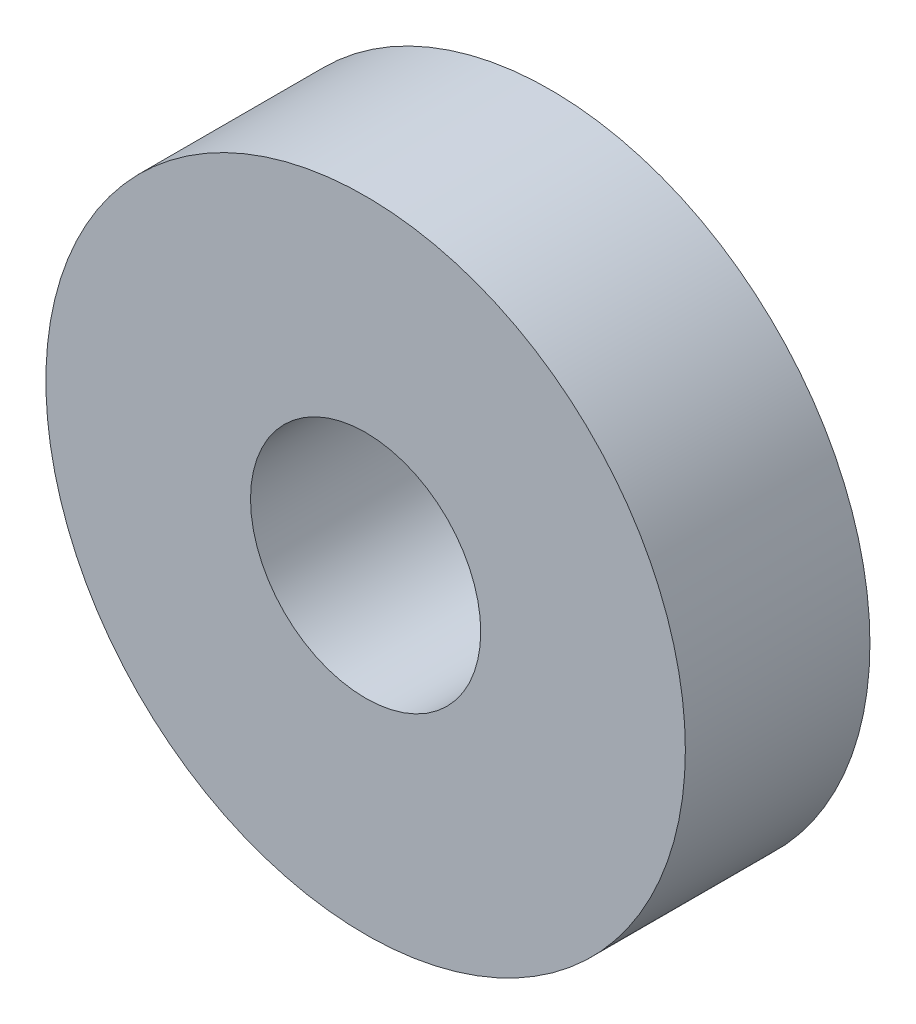
ISO-10303-21;
HEADER;
FILE_DESCRIPTION(('STEP AP214'),'2;1');
FILE_NAME('part.step','',(''),(''),'','','');
FILE_SCHEMA(('AUTOMOTIVE_DESIGN { 1 0 10303 214 1 1 1 1 }'));
ENDSEC;
DATA;
#1=APPLICATION_CONTEXT('core data for automotive mechanical design processes');
#2=APPLICATION_PROTOCOL_DEFINITION('international standard','automotive_design',2000,#1);
#3=PRODUCT_CONTEXT('',#1,'mechanical');
#4=PRODUCT('Part','Part','',(#3));
#5=PRODUCT_RELATED_PRODUCT_CATEGORY('part','',(#4));
#6=PRODUCT_DEFINITION_FORMATION('','',#4);
#7=PRODUCT_DEFINITION_CONTEXT('part definition',#1,'design');
#8=PRODUCT_DEFINITION('design','',#6,#7);
#9=PRODUCT_DEFINITION_SHAPE('','',#8);
#10=(LENGTH_UNIT() NAMED_UNIT(*) SI_UNIT(.MILLI.,.METRE.));
#11=(NAMED_UNIT(*) PLANE_ANGLE_UNIT() SI_UNIT($,.RADIAN.));
#12=(NAMED_UNIT(*) SI_UNIT($,.STERADIAN.) SOLID_ANGLE_UNIT());
#13=UNCERTAINTY_MEASURE_WITH_UNIT(LENGTH_MEASURE(1.E-05),#10,'distance_accuracy_value','');
#14=(GEOMETRIC_REPRESENTATION_CONTEXT(3) GLOBAL_UNCERTAINTY_ASSIGNED_CONTEXT((#13)) GLOBAL_UNIT_ASSIGNED_CONTEXT((#10,
#11,#12)) REPRESENTATION_CONTEXT('',''));
#15=CARTESIAN_POINT('',(0.,0.,0.));
#16=DIRECTION('',(0.,0.,1.));
#17=DIRECTION('',(1.,0.,0.));
#18=AXIS2_PLACEMENT_3D('',#15,#16,#17);
#19=CARTESIAN_POINT('',(0.,0.,6.35));
#20=DIRECTION('',(0.,0.,1.));
#21=DIRECTION('',(1.,0.,0.));
#22=AXIS2_PLACEMENT_3D('',#19,#20,#21);
#23=PLANE('',#22);
#24=CARTESIAN_POINT('',(0.,0.,6.35));
#25=DIRECTION('',(0.,0.,1.));
#26=DIRECTION('',(1.,0.,0.));
#27=AXIS2_PLACEMENT_3D('',#24,#25,#26);
#28=CIRCLE('',#27,11.);
#29=CARTESIAN_POINT('',(11.,0.,6.35));
#30=VERTEX_POINT('',#29);
#31=EDGE_CURVE('E10',#30,#30,#28,.T.);
#32=ORIENTED_EDGE('',*,*,#31,.T.);
#33=EDGE_LOOP('',(#32));
#34=FACE_BOUND('',#33,.T.);
#35=CARTESIAN_POINT('',(0.,0.,6.35));
#36=DIRECTION('',(0.,0.,1.));
#37=DIRECTION('',(1.,0.,0.));
#38=AXIS2_PLACEMENT_3D('',#35,#36,#37);
#39=CIRCLE('',#38,3.96);
#40=CARTESIAN_POINT('',(3.96,0.,6.35));
#41=VERTEX_POINT('',#40);
#42=EDGE_CURVE('E50',#41,#41,#39,.T.);
#43=ORIENTED_EDGE('',*,*,#42,.F.);
#44=EDGE_LOOP('',(#43));
#45=FACE_BOUND('',#44,.T.);
#46=ADVANCED_FACE('F37',(#34,#45),#23,.T.);
#47=CARTESIAN_POINT('',(0.,0.,0.));
#48=DIRECTION('',(0.,0.,1.));
#49=DIRECTION('',(1.,0.,0.));
#50=AXIS2_PLACEMENT_3D('',#47,#48,#49);
#51=PLANE('',#50);
#52=CARTESIAN_POINT('',(0.,0.,0.));
#53=DIRECTION('',(0.,0.,1.));
#54=DIRECTION('',(1.,0.,0.));
#55=AXIS2_PLACEMENT_3D('',#52,#53,#54);
#56=CIRCLE('',#55,11.);
#57=CARTESIAN_POINT('',(11.,0.,0.));
#58=VERTEX_POINT('',#57);
#59=EDGE_CURVE('E41',#58,#58,#56,.T.);
#60=ORIENTED_EDGE('',*,*,#59,.F.);
#61=EDGE_LOOP('',(#60));
#62=FACE_BOUND('',#61,.T.);
#63=CARTESIAN_POINT('',(0.,0.,0.));
#64=DIRECTION('',(0.,0.,1.));
#65=DIRECTION('',(1.,0.,0.));
#66=AXIS2_PLACEMENT_3D('',#63,#64,#65);
#67=CIRCLE('',#66,3.96);
#68=CARTESIAN_POINT('',(3.96,0.,0.));
#69=VERTEX_POINT('',#68);
#70=EDGE_CURVE('E52',#69,#69,#67,.T.);
#71=ORIENTED_EDGE('',*,*,#70,.T.);
#72=EDGE_LOOP('',(#71));
#73=FACE_BOUND('',#72,.T.);
#74=ADVANCED_FACE('F64',(#62,#73),#51,.F.);
#75=CARTESIAN_POINT('',(0.,0.,6.35));
#76=DIRECTION('',(0.,0.,-1.));
#77=DIRECTION('',(-1.,0.,0.));
#78=AXIS2_PLACEMENT_3D('',#75,#76,#77);
#79=CYLINDRICAL_SURFACE('',#78,11.);
#80=ORIENTED_EDGE('',*,*,#31,.F.);
#81=EDGE_LOOP('',(#80));
#82=FACE_BOUND('',#81,.T.);
#83=ORIENTED_EDGE('',*,*,#59,.T.);
#84=EDGE_LOOP('',(#83));
#85=FACE_BOUND('',#84,.T.);
#86=ADVANCED_FACE('F39',(#82,#85),#79,.T.);
#87=CARTESIAN_POINT('',(0.,0.,6.35));
#88=DIRECTION('',(0.,0.,-1.));
#89=DIRECTION('',(-1.,0.,0.));
#90=AXIS2_PLACEMENT_3D('',#87,#88,#89);
#91=CYLINDRICAL_SURFACE('',#90,3.96);
#92=ORIENTED_EDGE('',*,*,#42,.T.);
#93=EDGE_LOOP('',(#92));
#94=FACE_BOUND('',#93,.T.);
#95=ORIENTED_EDGE('',*,*,#70,.F.);
#96=EDGE_LOOP('',(#95));
#97=FACE_BOUND('',#96,.T.);
#98=ADVANCED_FACE('F60',(#94,#97),#91,.F.);
#99=CLOSED_SHELL('',(#46,#74,#86,#98));
#100=MANIFOLD_SOLID_BREP('B2',#99);
#101=ADVANCED_BREP_SHAPE_REPRESENTATION('',(#18,#100),#14);
#102=SHAPE_DEFINITION_REPRESENTATION(#9,#101);
ENDSEC;
END-ISO-10303-21;
